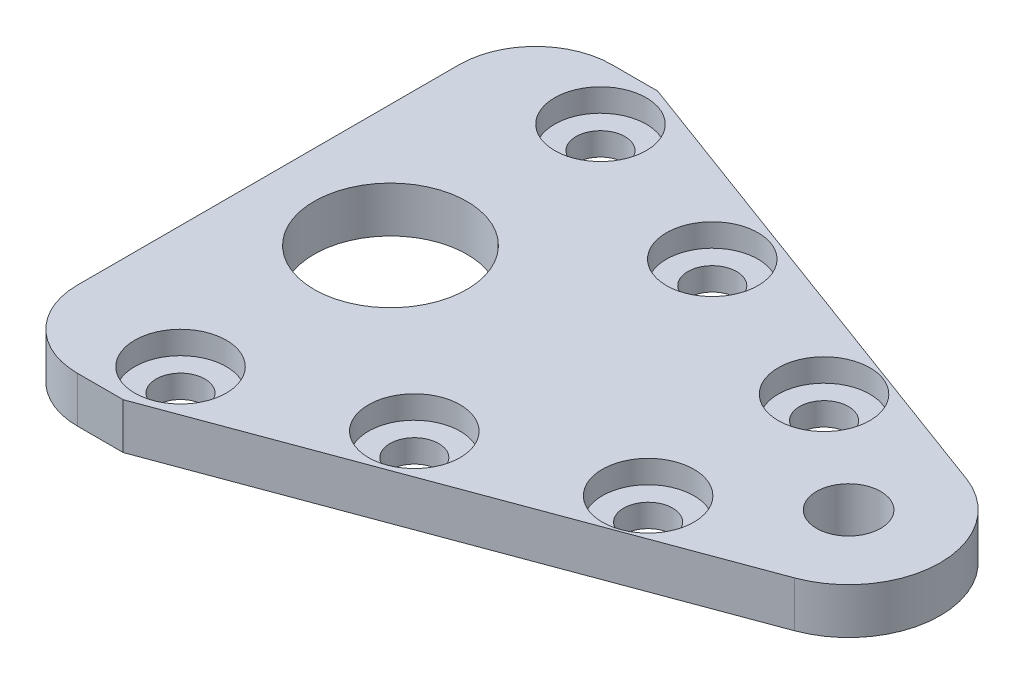
ISO-10303-21;
HEADER;
FILE_DESCRIPTION(('STEP AP214'),'2;1');
FILE_NAME('part.step','',(''),(''),'','','');
FILE_SCHEMA(('AUTOMOTIVE_DESIGN { 1 0 10303 214 1 1 1 1 }'));
ENDSEC;
DATA;
#1=APPLICATION_CONTEXT('core data for automotive mechanical design processes');
#2=APPLICATION_PROTOCOL_DEFINITION('international standard','automotive_design',2000,#1);
#3=PRODUCT_CONTEXT('',#1,'mechanical');
#4=PRODUCT('Part','Part','',(#3));
#5=PRODUCT_RELATED_PRODUCT_CATEGORY('part','',(#4));
#6=PRODUCT_DEFINITION_FORMATION('','',#4);
#7=PRODUCT_DEFINITION_CONTEXT('part definition',#1,'design');
#8=PRODUCT_DEFINITION('design','',#6,#7);
#9=PRODUCT_DEFINITION_SHAPE('','',#8);
#10=(LENGTH_UNIT() NAMED_UNIT(*) SI_UNIT(.MILLI.,.METRE.));
#11=(NAMED_UNIT(*) PLANE_ANGLE_UNIT() SI_UNIT($,.RADIAN.));
#12=(NAMED_UNIT(*) SI_UNIT($,.STERADIAN.) SOLID_ANGLE_UNIT());
#13=UNCERTAINTY_MEASURE_WITH_UNIT(LENGTH_MEASURE(1.E-05),#10,'distance_accuracy_value','');
#14=(GEOMETRIC_REPRESENTATION_CONTEXT(3) GLOBAL_UNCERTAINTY_ASSIGNED_CONTEXT((#13)) GLOBAL_UNIT_ASSIGNED_CONTEXT((#10,
#11,#12)) REPRESENTATION_CONTEXT('',''));
#15=CARTESIAN_POINT('',(0.,0.,0.));
#16=DIRECTION('',(0.,0.,1.));
#17=DIRECTION('',(1.,0.,0.));
#18=AXIS2_PLACEMENT_3D('',#15,#16,#17);
#19=CARTESIAN_POINT('',(0.,-7.,13.75));
#20=DIRECTION('',(0.,1.,0.));
#21=DIRECTION('',(0.,0.,1.));
#22=AXIS2_PLACEMENT_3D('',#19,#20,#21);
#23=CYLINDRICAL_SURFACE('',#22,1.6);
#24=CARTESIAN_POINT('',(0.,0.,13.75));
#25=DIRECTION('',(0.,1.,0.));
#26=DIRECTION('',(0.,0.,1.));
#27=AXIS2_PLACEMENT_3D('',#24,#25,#26);
#28=CIRCLE('',#27,1.6);
#29=CARTESIAN_POINT('',(0.,0.,15.35));
#30=VERTEX_POINT('',#29);
#31=EDGE_CURVE('E172',#30,#30,#28,.T.);
#32=ORIENTED_EDGE('',*,*,#31,.F.);
#33=EDGE_LOOP('',(#32));
#34=FACE_BOUND('',#33,.T.);
#35=CARTESIAN_POINT('',(0.,1.5,13.75));
#36=DIRECTION('',(0.,1.,0.));
#37=DIRECTION('',(0.,0.,1.));
#38=AXIS2_PLACEMENT_3D('',#35,#36,#37);
#39=CIRCLE('',#38,1.6);
#40=CARTESIAN_POINT('',(0.,1.5,15.35));
#41=VERTEX_POINT('',#40);
#42=EDGE_CURVE('E43',#41,#41,#39,.F.);
#43=ORIENTED_EDGE('',*,*,#42,.F.);
#44=EDGE_LOOP('',(#43));
#45=FACE_BOUND('',#44,.T.);
#46=ADVANCED_FACE('F39',(#34,#45),#23,.F.);
#47=CARTESIAN_POINT('',(22.6308770816271,-7.,-5.75979333707286));
#48=DIRECTION('',(0.,1.,0.));
#49=DIRECTION('',(0.,0.,1.));
#50=AXIS2_PLACEMENT_3D('',#47,#48,#49);
#51=CYLINDRICAL_SURFACE('',#50,1.6);
#52=CARTESIAN_POINT('',(22.6308770816271,0.,-5.75979333707286));
#53=DIRECTION('',(0.,1.,0.));
#54=DIRECTION('',(0.,0.,1.));
#55=AXIS2_PLACEMENT_3D('',#52,#53,#54);
#56=CIRCLE('',#55,1.6);
#57=CARTESIAN_POINT('',(22.6308770816271,0.,-4.15979333707286));
#58=VERTEX_POINT('',#57);
#59=EDGE_CURVE('E175',#58,#58,#56,.T.);
#60=ORIENTED_EDGE('',*,*,#59,.F.);
#61=EDGE_LOOP('',(#60));
#62=FACE_BOUND('',#61,.T.);
#63=CARTESIAN_POINT('',(22.6308770816271,1.5,-5.75979333707286));
#64=DIRECTION('',(0.,1.,0.));
#65=DIRECTION('',(0.,0.,1.));
#66=AXIS2_PLACEMENT_3D('',#63,#64,#65);
#67=CIRCLE('',#66,1.6);
#68=CARTESIAN_POINT('',(22.6308770816271,1.5,-4.15979333707286));
#69=VERTEX_POINT('',#68);
#70=EDGE_CURVE('E212',#69,#69,#67,.F.);
#71=ORIENTED_EDGE('',*,*,#70,.F.);
#72=EDGE_LOOP('',(#71));
#73=FACE_BOUND('',#72,.T.);
#74=ADVANCED_FACE('F222',(#62,#73),#51,.F.);
#75=CARTESIAN_POINT('',(11.3154385408135,-7.,-9.75489666853643));
#76=DIRECTION('',(0.,1.,0.));
#77=DIRECTION('',(0.,0.,1.));
#78=AXIS2_PLACEMENT_3D('',#75,#76,#77);
#79=CYLINDRICAL_SURFACE('',#78,1.6);
#80=CARTESIAN_POINT('',(11.3154385408135,0.,-9.75489666853643));
#81=DIRECTION('',(0.,1.,0.));
#82=DIRECTION('',(0.,0.,1.));
#83=AXIS2_PLACEMENT_3D('',#80,#81,#82);
#84=CIRCLE('',#83,1.6);
#85=CARTESIAN_POINT('',(11.3154385408135,0.,-8.15489666853643));
#86=VERTEX_POINT('',#85);
#87=EDGE_CURVE('E178',#86,#86,#84,.T.);
#88=ORIENTED_EDGE('',*,*,#87,.F.);
#89=EDGE_LOOP('',(#88));
#90=FACE_BOUND('',#89,.T.);
#91=CARTESIAN_POINT('',(11.3154385408135,1.5,-9.75489666853643));
#92=DIRECTION('',(0.,1.,0.));
#93=DIRECTION('',(0.,0.,1.));
#94=AXIS2_PLACEMENT_3D('',#91,#92,#93);
#95=CIRCLE('',#94,1.6);
#96=CARTESIAN_POINT('',(11.3154385408135,1.5,-8.15489666853643));
#97=VERTEX_POINT('',#96);
#98=EDGE_CURVE('E210',#97,#97,#95,.F.);
#99=ORIENTED_EDGE('',*,*,#98,.F.);
#100=EDGE_LOOP('',(#99));
#101=FACE_BOUND('',#100,.T.);
#102=ADVANCED_FACE('F228',(#90,#101),#79,.F.);
#103=CARTESIAN_POINT('',(22.6308770816271,-7.,5.75979333707283));
#104=DIRECTION('',(0.,1.,0.));
#105=DIRECTION('',(0.,0.,1.));
#106=AXIS2_PLACEMENT_3D('',#103,#104,#105);
#107=CYLINDRICAL_SURFACE('',#106,1.6);
#108=CARTESIAN_POINT('',(22.6308770816271,0.,5.75979333707283));
#109=DIRECTION('',(0.,1.,0.));
#110=DIRECTION('',(0.,0.,1.));
#111=AXIS2_PLACEMENT_3D('',#108,#109,#110);
#112=CIRCLE('',#111,1.6);
#113=CARTESIAN_POINT('',(22.6308770816271,0.,7.35979333707284));
#114=VERTEX_POINT('',#113);
#115=EDGE_CURVE('E181',#114,#114,#112,.T.);
#116=ORIENTED_EDGE('',*,*,#115,.F.);
#117=EDGE_LOOP('',(#116));
#118=FACE_BOUND('',#117,.T.);
#119=CARTESIAN_POINT('',(22.6308770816271,1.5,5.75979333707283));
#120=DIRECTION('',(0.,1.,0.));
#121=DIRECTION('',(0.,0.,1.));
#122=AXIS2_PLACEMENT_3D('',#119,#120,#121);
#123=CIRCLE('',#122,1.6);
#124=CARTESIAN_POINT('',(22.6308770816271,1.5,7.35979333707284));
#125=VERTEX_POINT('',#124);
#126=EDGE_CURVE('E207',#125,#125,#123,.F.);
#127=ORIENTED_EDGE('',*,*,#126,.F.);
#128=EDGE_LOOP('',(#127));
#129=FACE_BOUND('',#128,.T.);
#130=ADVANCED_FACE('F234',(#118,#129),#107,.F.);
#131=CARTESIAN_POINT('',(11.3154385408135,-7.,9.75489666853641));
#132=DIRECTION('',(0.,1.,0.));
#133=DIRECTION('',(0.,0.,1.));
#134=AXIS2_PLACEMENT_3D('',#131,#132,#133);
#135=CYLINDRICAL_SURFACE('',#134,1.6);
#136=CARTESIAN_POINT('',(11.3154385408135,0.,9.75489666853641));
#137=DIRECTION('',(0.,1.,0.));
#138=DIRECTION('',(0.,0.,1.));
#139=AXIS2_PLACEMENT_3D('',#136,#137,#138);
#140=CIRCLE('',#139,1.6);
#141=CARTESIAN_POINT('',(11.3154385408135,0.,11.3548966685364));
#142=VERTEX_POINT('',#141);
#143=EDGE_CURVE('E184',#142,#142,#140,.T.);
#144=ORIENTED_EDGE('',*,*,#143,.F.);
#145=EDGE_LOOP('',(#144));
#146=FACE_BOUND('',#145,.T.);
#147=CARTESIAN_POINT('',(11.3154385408135,1.5,9.75489666853641));
#148=DIRECTION('',(0.,1.,0.));
#149=DIRECTION('',(0.,0.,1.));
#150=AXIS2_PLACEMENT_3D('',#147,#148,#149);
#151=CIRCLE('',#150,1.6);
#152=CARTESIAN_POINT('',(11.3154385408135,1.5,11.3548966685364));
#153=VERTEX_POINT('',#152);
#154=EDGE_CURVE('E203',#153,#153,#151,.F.);
#155=ORIENTED_EDGE('',*,*,#154,.F.);
#156=EDGE_LOOP('',(#155));
#157=FACE_BOUND('',#156,.T.);
#158=ADVANCED_FACE('F237',(#146,#157),#135,.F.);
#159=CARTESIAN_POINT('',(0.,-7.,-13.75));
#160=DIRECTION('',(0.,1.,0.));
#161=DIRECTION('',(0.,0.,1.));
#162=AXIS2_PLACEMENT_3D('',#159,#160,#161);
#163=CYLINDRICAL_SURFACE('',#162,1.6);
#164=CARTESIAN_POINT('',(0.,0.,-13.75));
#165=DIRECTION('',(0.,1.,0.));
#166=DIRECTION('',(0.,0.,1.));
#167=AXIS2_PLACEMENT_3D('',#164,#165,#166);
#168=CIRCLE('',#167,1.6);
#169=CARTESIAN_POINT('',(0.,0.,-12.15));
#170=VERTEX_POINT('',#169);
#171=EDGE_CURVE('E151',#170,#170,#168,.T.);
#172=ORIENTED_EDGE('',*,*,#171,.F.);
#173=EDGE_LOOP('',(#172));
#174=FACE_BOUND('',#173,.T.);
#175=CARTESIAN_POINT('',(0.,1.5,-13.75));
#176=DIRECTION('',(0.,1.,0.));
#177=DIRECTION('',(0.,0.,1.));
#178=AXIS2_PLACEMENT_3D('',#175,#176,#177);
#179=CIRCLE('',#178,1.6);
#180=CARTESIAN_POINT('',(0.,1.5,-12.15));
#181=VERTEX_POINT('',#180);
#182=EDGE_CURVE('E200',#181,#181,#179,.F.);
#183=ORIENTED_EDGE('',*,*,#182,.F.);
#184=EDGE_LOOP('',(#183));
#185=FACE_BOUND('',#184,.T.);
#186=ADVANCED_FACE('F274',(#174,#185),#163,.F.);
#187=CARTESIAN_POINT('',(30.,3.,0.));
#188=DIRECTION('',(0.,-1.,0.));
#189=DIRECTION('',(0.,0.,-1.));
#190=AXIS2_PLACEMENT_3D('',#187,#188,#189);
#191=CYLINDRICAL_SURFACE('',#190,6.00000000000001);
#192=CARTESIAN_POINT('',(30.,0.,0.));
#193=DIRECTION('',(0.,1.,0.));
#194=DIRECTION('',(0.,0.,1.));
#195=AXIS2_PLACEMENT_3D('',#192,#193,#194);
#196=CIRCLE('',#195,6.00000000000001);
#197=CARTESIAN_POINT('',(32.0824342229641,0.,5.62703009650987));
#198=VERTEX_POINT('',#197);
#199=CARTESIAN_POINT('',(32.0824342229641,0.,-5.62703009650988));
#200=VERTEX_POINT('',#199);
#201=EDGE_CURVE('E124',#198,#200,#196,.T.);
#202=ORIENTED_EDGE('',*,*,#201,.T.);
#203=DIRECTION('',(0.,-1.,0.));
#204=VECTOR('',#203,1.);
#205=CARTESIAN_POINT('',(32.0824342229641,3.,-5.62703009650988));
#206=LINE('',#205,#204);
#207=CARTESIAN_POINT('',(32.0824342229641,3.,-5.62703009650988));
#208=VERTEX_POINT('',#207);
#209=EDGE_CURVE('E121',#208,#200,#206,.T.);
#210=ORIENTED_EDGE('',*,*,#209,.F.);
#211=CARTESIAN_POINT('',(30.,3.,0.));
#212=DIRECTION('',(0.,1.,0.));
#213=DIRECTION('',(0.,0.,1.));
#214=AXIS2_PLACEMENT_3D('',#211,#212,#213);
#215=CIRCLE('',#214,6.00000000000001);
#216=CARTESIAN_POINT('',(32.0824342229641,3.,5.62703009650987));
#217=VERTEX_POINT('',#216);
#218=EDGE_CURVE('E107',#217,#208,#215,.T.);
#219=ORIENTED_EDGE('',*,*,#218,.F.);
#220=DIRECTION('',(0.,-1.,0.));
#221=VECTOR('',#220,1.);
#222=CARTESIAN_POINT('',(32.0824342229641,3.,5.62703009650987));
#223=LINE('',#222,#221);
#224=EDGE_CURVE('E147',#217,#198,#223,.T.);
#225=ORIENTED_EDGE('',*,*,#224,.T.);
#226=EDGE_LOOP('',(#202,#210,#219,#225));
#227=FACE_BOUND('',#226,.T.);
#228=ADVANCED_FACE('F122',(#227),#191,.T.);
#229=CARTESIAN_POINT('',(5.69621113377415,3.,-15.3919634686941));
#230=DIRECTION('',(0.347072370494016,0.,-0.937838349418312));
#231=DIRECTION('',(-0.937838349418313,0.,-0.347072370494016));
#232=AXIS2_PLACEMENT_3D('',#229,#230,#231);
#233=PLANE('',#232);
#234=DIRECTION('',(0.937838349418313,0.,0.347072370494016));
#235=VECTOR('',#234,1.);
#236=CARTESIAN_POINT('',(5.69621113377415,0.,-15.3919634686941));
#237=LINE('',#236,#235);
#238=CARTESIAN_POINT('',(0.,0.,-17.5));
#239=VERTEX_POINT('',#238);
#240=EDGE_CURVE('E153',#239,#200,#237,.T.);
#241=ORIENTED_EDGE('',*,*,#240,.F.);
#242=DIRECTION('',(0.,-1.,0.));
#243=VECTOR('',#242,1.);
#244=CARTESIAN_POINT('',(0.,3.,-17.5));
#245=LINE('',#244,#243);
#246=CARTESIAN_POINT('',(0.,3.,-17.5));
#247=VERTEX_POINT('',#246);
#248=EDGE_CURVE('E129',#247,#239,#245,.T.);
#249=ORIENTED_EDGE('',*,*,#248,.F.);
#250=DIRECTION('',(0.937838349418313,0.,0.347072370494016));
#251=VECTOR('',#250,1.);
#252=CARTESIAN_POINT('',(5.69621113377415,3.,-15.3919634686941));
#253=LINE('',#252,#251);
#254=EDGE_CURVE('E112',#247,#208,#253,.T.);
#255=ORIENTED_EDGE('',*,*,#254,.T.);
#256=ORIENTED_EDGE('',*,*,#209,.T.);
#257=EDGE_LOOP('',(#241,#249,#255,#256));
#258=FACE_BOUND('',#257,.T.);
#259=ADVANCED_FACE('F132',(#258),#233,.T.);
#260=CARTESIAN_POINT('',(0.,3.,-17.5));
#261=DIRECTION('',(0.,0.,-1.));
#262=DIRECTION('',(-1.,0.,0.));
#263=AXIS2_PLACEMENT_3D('',#260,#261,#262);
#264=PLANE('',#263);
#265=DIRECTION('',(1.,0.,0.));
#266=VECTOR('',#265,1.);
#267=CARTESIAN_POINT('',(0.,0.,-17.5));
#268=LINE('',#267,#266);
#269=CARTESIAN_POINT('',(-3.,0.,-17.5));
#270=VERTEX_POINT('',#269);
#271=EDGE_CURVE('E155',#270,#239,#268,.T.);
#272=ORIENTED_EDGE('',*,*,#271,.F.);
#273=DIRECTION('',(0.,-1.,0.));
#274=VECTOR('',#273,1.);
#275=CARTESIAN_POINT('',(-3.,3.,-17.5));
#276=LINE('',#275,#274);
#277=CARTESIAN_POINT('',(-3.,3.,-17.5));
#278=VERTEX_POINT('',#277);
#279=EDGE_CURVE('E64',#270,#278,#276,.F.);
#280=ORIENTED_EDGE('',*,*,#279,.T.);
#281=DIRECTION('',(1.,0.,0.));
#282=VECTOR('',#281,1.);
#283=CARTESIAN_POINT('',(0.,3.,-17.5));
#284=LINE('',#283,#282);
#285=EDGE_CURVE('E134',#278,#247,#284,.T.);
#286=ORIENTED_EDGE('',*,*,#285,.T.);
#287=ORIENTED_EDGE('',*,*,#248,.T.);
#288=EDGE_LOOP('',(#272,#280,#286,#287));
#289=FACE_BOUND('',#288,.T.);
#290=ADVANCED_FACE('F266',(#289),#264,.T.);
#291=CARTESIAN_POINT('',(-8.,3.,0.));
#292=DIRECTION('',(1.,0.,0.));
#293=DIRECTION('',(0.,0.,-1.));
#294=AXIS2_PLACEMENT_3D('',#291,#292,#293);
#295=PLANE('',#294);
#296=DIRECTION('',(0.,0.,1.));
#297=VECTOR('',#296,1.);
#298=CARTESIAN_POINT('',(-8.,3.,0.));
#299=LINE('',#298,#297);
#300=CARTESIAN_POINT('',(-8.,3.,-12.5));
#301=VERTEX_POINT('',#300);
#302=CARTESIAN_POINT('',(-8.,3.,12.5));
#303=VERTEX_POINT('',#302);
#304=EDGE_CURVE('E136',#301,#303,#299,.T.);
#305=ORIENTED_EDGE('',*,*,#304,.F.);
#306=DIRECTION('',(0.,-1.,0.));
#307=VECTOR('',#306,1.);
#308=CARTESIAN_POINT('',(-8.,0.,-12.5));
#309=LINE('',#308,#307);
#310=CARTESIAN_POINT('',(-8.,0.,-12.5));
#311=VERTEX_POINT('',#310);
#312=EDGE_CURVE('E190',#301,#311,#309,.T.);
#313=ORIENTED_EDGE('',*,*,#312,.T.);
#314=DIRECTION('',(0.,0.,1.));
#315=VECTOR('',#314,1.);
#316=CARTESIAN_POINT('',(-8.,0.,0.));
#317=LINE('',#316,#315);
#318=CARTESIAN_POINT('',(-8.,0.,12.5));
#319=VERTEX_POINT('',#318);
#320=EDGE_CURVE('E157',#311,#319,#317,.T.);
#321=ORIENTED_EDGE('',*,*,#320,.T.);
#322=DIRECTION('',(0.,-1.,0.));
#323=VECTOR('',#322,1.);
#324=CARTESIAN_POINT('',(-8.,3.,12.5));
#325=LINE('',#324,#323);
#326=EDGE_CURVE('E128',#319,#303,#325,.F.);
#327=ORIENTED_EDGE('',*,*,#326,.T.);
#328=EDGE_LOOP('',(#305,#313,#321,#327));
#329=FACE_BOUND('',#328,.T.);
#330=ADVANCED_FACE('F262',(#329),#295,.F.);
#331=CARTESIAN_POINT('',(0.,3.,17.5));
#332=DIRECTION('',(0.,0.,-1.));
#333=DIRECTION('',(-1.,0.,0.));
#334=AXIS2_PLACEMENT_3D('',#331,#332,#333);
#335=PLANE('',#334);
#336=DIRECTION('',(1.,0.,0.));
#337=VECTOR('',#336,1.);
#338=CARTESIAN_POINT('',(0.,3.,17.5));
#339=LINE('',#338,#337);
#340=CARTESIAN_POINT('',(-3.,3.,17.5));
#341=VERTEX_POINT('',#340);
#342=CARTESIAN_POINT('',(0.,3.,17.5));
#343=VERTEX_POINT('',#342);
#344=EDGE_CURVE('E141',#341,#343,#339,.T.);
#345=ORIENTED_EDGE('',*,*,#344,.F.);
#346=DIRECTION('',(0.,-1.,0.));
#347=VECTOR('',#346,1.);
#348=CARTESIAN_POINT('',(-3.,3.,17.5));
#349=LINE('',#348,#347);
#350=CARTESIAN_POINT('',(-3.,0.,17.5));
#351=VERTEX_POINT('',#350);
#352=EDGE_CURVE('E11',#341,#351,#349,.T.);
#353=ORIENTED_EDGE('',*,*,#352,.T.);
#354=DIRECTION('',(1.,0.,0.));
#355=VECTOR('',#354,1.);
#356=CARTESIAN_POINT('',(0.,0.,17.5));
#357=LINE('',#356,#355);
#358=CARTESIAN_POINT('',(0.,0.,17.5));
#359=VERTEX_POINT('',#358);
#360=EDGE_CURVE('E160',#351,#359,#357,.T.);
#361=ORIENTED_EDGE('',*,*,#360,.T.);
#362=DIRECTION('',(0.,-1.,0.));
#363=VECTOR('',#362,1.);
#364=CARTESIAN_POINT('',(0.,3.,17.5));
#365=LINE('',#364,#363);
#366=EDGE_CURVE('E168',#343,#359,#365,.T.);
#367=ORIENTED_EDGE('',*,*,#366,.F.);
#368=EDGE_LOOP('',(#345,#353,#361,#367));
#369=FACE_BOUND('',#368,.T.);
#370=ADVANCED_FACE('F258',(#369),#335,.F.);
#371=CARTESIAN_POINT('',(5.69621113377415,3.,15.3919634686941));
#372=DIRECTION('',(-0.347072370494016,0.,-0.937838349418312));
#373=DIRECTION('',(-0.937838349418313,0.,0.347072370494016));
#374=AXIS2_PLACEMENT_3D('',#371,#372,#373);
#375=PLANE('',#374);
#376=DIRECTION('',(0.937838349418313,0.,-0.347072370494016));
#377=VECTOR('',#376,1.);
#378=CARTESIAN_POINT('',(5.69621113377415,0.,15.3919634686941));
#379=LINE('',#378,#377);
#380=EDGE_CURVE('E162',#359,#198,#379,.T.);
#381=ORIENTED_EDGE('',*,*,#380,.T.);
#382=ORIENTED_EDGE('',*,*,#224,.F.);
#383=DIRECTION('',(0.937838349418313,0.,-0.347072370494016));
#384=VECTOR('',#383,1.);
#385=CARTESIAN_POINT('',(5.69621113377415,3.,15.3919634686941));
#386=LINE('',#385,#384);
#387=EDGE_CURVE('E114',#343,#217,#386,.T.);
#388=ORIENTED_EDGE('',*,*,#387,.F.);
#389=ORIENTED_EDGE('',*,*,#366,.T.);
#390=EDGE_LOOP('',(#381,#382,#388,#389));
#391=FACE_BOUND('',#390,.T.);
#392=ADVANCED_FACE('F255',(#391),#375,.F.);
#393=CARTESIAN_POINT('',(30.,3.,0.));
#394=DIRECTION('',(0.,-1.,0.));
#395=DIRECTION('',(0.,0.,-1.));
#396=AXIS2_PLACEMENT_3D('',#393,#394,#395);
#397=CYLINDRICAL_SURFACE('',#396,2.09999999999999);
#398=CARTESIAN_POINT('',(30.,3.,0.));
#399=DIRECTION('',(0.,1.,0.));
#400=DIRECTION('',(0.,0.,1.));
#401=AXIS2_PLACEMENT_3D('',#398,#399,#400);
#402=CIRCLE('',#401,2.09999999999999);
#403=CARTESIAN_POINT('',(30.,3.,2.09999999999999));
#404=VERTEX_POINT('',#403);
#405=EDGE_CURVE('E118',#404,#404,#402,.T.);
#406=ORIENTED_EDGE('',*,*,#405,.T.);
#407=EDGE_LOOP('',(#406));
#408=FACE_BOUND('',#407,.T.);
#409=CARTESIAN_POINT('',(30.,0.,0.));
#410=DIRECTION('',(0.,1.,0.));
#411=DIRECTION('',(0.,0.,1.));
#412=AXIS2_PLACEMENT_3D('',#409,#410,#411);
#413=CIRCLE('',#412,2.09999999999999);
#414=CARTESIAN_POINT('',(30.,0.,2.09999999999999));
#415=VERTEX_POINT('',#414);
#416=EDGE_CURVE('E148',#415,#415,#413,.T.);
#417=ORIENTED_EDGE('',*,*,#416,.F.);
#418=EDGE_LOOP('',(#417));
#419=FACE_BOUND('',#418,.T.);
#420=ADVANCED_FACE('F253',(#408,#419),#397,.F.);
#421=CARTESIAN_POINT('',(0.,3.,0.));
#422=DIRECTION('',(0.,-1.,0.));
#423=DIRECTION('',(0.,0.,-1.));
#424=AXIS2_PLACEMENT_3D('',#421,#422,#423);
#425=CYLINDRICAL_SURFACE('',#424,5.);
#426=CARTESIAN_POINT('',(0.,3.,0.));
#427=DIRECTION('',(0.,1.,0.));
#428=DIRECTION('',(0.,0.,1.));
#429=AXIS2_PLACEMENT_3D('',#426,#427,#428);
#430=CIRCLE('',#429,5.);
#431=CARTESIAN_POINT('',(0.,3.,5.));
#432=VERTEX_POINT('',#431);
#433=EDGE_CURVE('E144',#432,#432,#430,.T.);
#434=ORIENTED_EDGE('',*,*,#433,.T.);
#435=EDGE_LOOP('',(#434));
#436=FACE_BOUND('',#435,.T.);
#437=CARTESIAN_POINT('',(0.,0.,0.));
#438=DIRECTION('',(0.,1.,0.));
#439=DIRECTION('',(0.,0.,1.));
#440=AXIS2_PLACEMENT_3D('',#437,#438,#439);
#441=CIRCLE('',#440,5.);
#442=CARTESIAN_POINT('',(0.,0.,5.));
#443=VERTEX_POINT('',#442);
#444=EDGE_CURVE('E164',#443,#443,#441,.T.);
#445=ORIENTED_EDGE('',*,*,#444,.F.);
#446=EDGE_LOOP('',(#445));
#447=FACE_BOUND('',#446,.T.);
#448=ADVANCED_FACE('F245',(#436,#447),#425,.F.);
#449=CARTESIAN_POINT('',(0.,3.,0.));
#450=DIRECTION('',(0.,1.,0.));
#451=DIRECTION('',(0.,0.,1.));
#452=AXIS2_PLACEMENT_3D('',#449,#450,#451);
#453=PLANE('',#452);
#454=CARTESIAN_POINT('',(0.,3.,13.75));
#455=DIRECTION('',(0.,1.,0.));
#456=DIRECTION('',(0.,0.,1.));
#457=AXIS2_PLACEMENT_3D('',#454,#455,#456);
#458=CIRCLE('',#457,3.);
#459=CARTESIAN_POINT('',(0.,3.,16.75));
#460=VERTEX_POINT('',#459);
#461=EDGE_CURVE('E354',#460,#460,#458,.T.);
#462=ORIENTED_EDGE('',*,*,#461,.F.);
#463=EDGE_LOOP('',(#462));
#464=FACE_BOUND('',#463,.T.);
#465=CARTESIAN_POINT('',(11.3154385408135,3.,9.75489666853641));
#466=DIRECTION('',(0.,1.,0.));
#467=DIRECTION('',(0.,0.,1.));
#468=AXIS2_PLACEMENT_3D('',#465,#466,#467);
#469=CIRCLE('',#468,3.);
#470=CARTESIAN_POINT('',(11.3154385408135,3.,12.7548966685364));
#471=VERTEX_POINT('',#470);
#472=EDGE_CURVE('E353',#471,#471,#469,.T.);
#473=ORIENTED_EDGE('',*,*,#472,.F.);
#474=EDGE_LOOP('',(#473));
#475=FACE_BOUND('',#474,.T.);
#476=CARTESIAN_POINT('',(22.6308770816271,3.,5.75979333707283));
#477=DIRECTION('',(0.,1.,0.));
#478=DIRECTION('',(0.,0.,1.));
#479=AXIS2_PLACEMENT_3D('',#476,#477,#478);
#480=CIRCLE('',#479,3.);
#481=CARTESIAN_POINT('',(22.6308770816271,3.,8.75979333707284));
#482=VERTEX_POINT('',#481);
#483=EDGE_CURVE('E392',#482,#482,#480,.T.);
#484=ORIENTED_EDGE('',*,*,#483,.F.);
#485=EDGE_LOOP('',(#484));
#486=FACE_BOUND('',#485,.T.);
#487=CARTESIAN_POINT('',(22.6308770816271,3.,-5.75979333707286));
#488=DIRECTION('',(0.,1.,0.));
#489=DIRECTION('',(0.,0.,1.));
#490=AXIS2_PLACEMENT_3D('',#487,#488,#489);
#491=CIRCLE('',#490,3.);
#492=CARTESIAN_POINT('',(22.6308770816271,3.,-2.75979333707286));
#493=VERTEX_POINT('',#492);
#494=EDGE_CURVE('E386',#493,#493,#491,.T.);
#495=ORIENTED_EDGE('',*,*,#494,.F.);
#496=EDGE_LOOP('',(#495));
#497=FACE_BOUND('',#496,.T.);
#498=CARTESIAN_POINT('',(11.3154385408135,3.,-9.75489666853643));
#499=DIRECTION('',(0.,1.,0.));
#500=DIRECTION('',(0.,0.,1.));
#501=AXIS2_PLACEMENT_3D('',#498,#499,#500);
#502=CIRCLE('',#501,3.);
#503=CARTESIAN_POINT('',(11.3154385408135,3.,-6.75489666853643));
#504=VERTEX_POINT('',#503);
#505=EDGE_CURVE('E376',#504,#504,#502,.T.);
#506=ORIENTED_EDGE('',*,*,#505,.F.);
#507=EDGE_LOOP('',(#506));
#508=FACE_BOUND('',#507,.T.);
#509=CARTESIAN_POINT('',(0.,3.,-13.75));
#510=DIRECTION('',(0.,1.,0.));
#511=DIRECTION('',(0.,0.,1.));
#512=AXIS2_PLACEMENT_3D('',#509,#510,#511);
#513=CIRCLE('',#512,3.);
#514=CARTESIAN_POINT('',(0.,3.,-10.75));
#515=VERTEX_POINT('',#514);
#516=EDGE_CURVE('E364',#515,#515,#513,.T.);
#517=ORIENTED_EDGE('',*,*,#516,.F.);
#518=EDGE_LOOP('',(#517));
#519=FACE_BOUND('',#518,.T.);
#520=ORIENTED_EDGE('',*,*,#405,.F.);
#521=EDGE_LOOP('',(#520));
#522=FACE_BOUND('',#521,.T.);
#523=ORIENTED_EDGE('',*,*,#285,.F.);
#524=CARTESIAN_POINT('',(-3.,3.,-12.5));
#525=DIRECTION('',(0.,1.,0.));
#526=DIRECTION('',(0.,0.,1.));
#527=AXIS2_PLACEMENT_3D('',#524,#525,#526);
#528=CIRCLE('',#527,5.);
#529=EDGE_CURVE('E48',#278,#301,#528,.T.);
#530=ORIENTED_EDGE('',*,*,#529,.T.);
#531=ORIENTED_EDGE('',*,*,#304,.T.);
#532=CARTESIAN_POINT('',(-3.,3.,12.5));
#533=DIRECTION('',(0.,1.,0.));
#534=DIRECTION('',(0.,0.,1.));
#535=AXIS2_PLACEMENT_3D('',#532,#533,#534);
#536=CIRCLE('',#535,5.);
#537=EDGE_CURVE('E56',#303,#341,#536,.T.);
#538=ORIENTED_EDGE('',*,*,#537,.T.);
#539=ORIENTED_EDGE('',*,*,#344,.T.);
#540=ORIENTED_EDGE('',*,*,#387,.T.);
#541=ORIENTED_EDGE('',*,*,#218,.T.);
#542=ORIENTED_EDGE('',*,*,#254,.F.);
#543=EDGE_LOOP('',(#523,#530,#531,#538,#539,#540,#541,#542));
#544=FACE_BOUND('',#543,.T.);
#545=ORIENTED_EDGE('',*,*,#433,.F.);
#546=EDGE_LOOP('',(#545));
#547=FACE_BOUND('',#546,.T.);
#548=ADVANCED_FACE('F109',(#464,#475,#486,#497,#508,#519,#522,#544,#547),#453,.T.);
#549=CARTESIAN_POINT('',(0.,0.,0.));
#550=DIRECTION('',(0.,1.,0.));
#551=DIRECTION('',(0.,0.,1.));
#552=AXIS2_PLACEMENT_3D('',#549,#550,#551);
#553=PLANE('',#552);
#554=ORIENTED_EDGE('',*,*,#171,.T.);
#555=EDGE_LOOP('',(#554));
#556=FACE_BOUND('',#555,.T.);
#557=ORIENTED_EDGE('',*,*,#143,.T.);
#558=EDGE_LOOP('',(#557));
#559=FACE_BOUND('',#558,.T.);
#560=ORIENTED_EDGE('',*,*,#115,.T.);
#561=EDGE_LOOP('',(#560));
#562=FACE_BOUND('',#561,.T.);
#563=ORIENTED_EDGE('',*,*,#87,.T.);
#564=EDGE_LOOP('',(#563));
#565=FACE_BOUND('',#564,.T.);
#566=ORIENTED_EDGE('',*,*,#59,.T.);
#567=EDGE_LOOP('',(#566));
#568=FACE_BOUND('',#567,.T.);
#569=ORIENTED_EDGE('',*,*,#31,.T.);
#570=EDGE_LOOP('',(#569));
#571=FACE_BOUND('',#570,.T.);
#572=ORIENTED_EDGE('',*,*,#416,.T.);
#573=EDGE_LOOP('',(#572));
#574=FACE_BOUND('',#573,.T.);
#575=ORIENTED_EDGE('',*,*,#320,.F.);
#576=CARTESIAN_POINT('',(-3.,0.,-12.5));
#577=DIRECTION('',(0.,1.,0.));
#578=DIRECTION('',(0.,0.,1.));
#579=AXIS2_PLACEMENT_3D('',#576,#577,#578);
#580=CIRCLE('',#579,5.);
#581=EDGE_CURVE('E195',#311,#270,#580,.F.);
#582=ORIENTED_EDGE('',*,*,#581,.T.);
#583=ORIENTED_EDGE('',*,*,#271,.T.);
#584=ORIENTED_EDGE('',*,*,#240,.T.);
#585=ORIENTED_EDGE('',*,*,#201,.F.);
#586=ORIENTED_EDGE('',*,*,#380,.F.);
#587=ORIENTED_EDGE('',*,*,#360,.F.);
#588=CARTESIAN_POINT('',(-3.,0.,12.5));
#589=DIRECTION('',(0.,1.,0.));
#590=DIRECTION('',(0.,0.,1.));
#591=AXIS2_PLACEMENT_3D('',#588,#589,#590);
#592=CIRCLE('',#591,5.);
#593=EDGE_CURVE('E193',#351,#319,#592,.F.);
#594=ORIENTED_EDGE('',*,*,#593,.T.);
#595=EDGE_LOOP('',(#575,#582,#583,#584,#585,#586,#587,#594));
#596=FACE_BOUND('',#595,.T.);
#597=ORIENTED_EDGE('',*,*,#444,.T.);
#598=EDGE_LOOP('',(#597));
#599=FACE_BOUND('',#598,.T.);
#600=ADVANCED_FACE('F244',(#556,#559,#562,#565,#568,#571,#574,#596,#599),#553,.F.);
#601=CARTESIAN_POINT('',(-3.,3.,-12.5));
#602=DIRECTION('',(0.,1.,0.));
#603=DIRECTION('',(0.,0.,1.));
#604=AXIS2_PLACEMENT_3D('',#601,#602,#603);
#605=CYLINDRICAL_SURFACE('',#604,5.);
#606=ORIENTED_EDGE('',*,*,#529,.F.);
#607=ORIENTED_EDGE('',*,*,#279,.F.);
#608=ORIENTED_EDGE('',*,*,#581,.F.);
#609=ORIENTED_EDGE('',*,*,#312,.F.);
#610=EDGE_LOOP('',(#606,#607,#608,#609));
#611=FACE_BOUND('',#610,.T.);
#612=ADVANCED_FACE('F249',(#611),#605,.T.);
#613=CARTESIAN_POINT('',(-3.,3.,12.5));
#614=DIRECTION('',(0.,-1.,0.));
#615=DIRECTION('',(0.,0.,-1.));
#616=AXIS2_PLACEMENT_3D('',#613,#614,#615);
#617=CYLINDRICAL_SURFACE('',#616,5.);
#618=ORIENTED_EDGE('',*,*,#537,.F.);
#619=ORIENTED_EDGE('',*,*,#326,.F.);
#620=ORIENTED_EDGE('',*,*,#593,.F.);
#621=ORIENTED_EDGE('',*,*,#352,.F.);
#622=EDGE_LOOP('',(#618,#619,#620,#621));
#623=FACE_BOUND('',#622,.T.);
#624=ADVANCED_FACE('F41',(#623),#617,.T.);
#625=CARTESIAN_POINT('',(0.,1.5,-13.75));
#626=DIRECTION('',(0.,1.,0.));
#627=DIRECTION('',(0.,0.,1.));
#628=AXIS2_PLACEMENT_3D('',#625,#626,#627);
#629=PLANE('',#628);
#630=CARTESIAN_POINT('',(0.,1.5,-13.75));
#631=DIRECTION('',(0.,1.,0.));
#632=DIRECTION('',(0.,0.,1.));
#633=AXIS2_PLACEMENT_3D('',#630,#631,#632);
#634=CIRCLE('',#633,3.);
#635=CARTESIAN_POINT('',(0.,1.5,-10.75));
#636=VERTEX_POINT('',#635);
#637=EDGE_CURVE('E204',#636,#636,#634,.T.);
#638=ORIENTED_EDGE('',*,*,#637,.T.);
#639=EDGE_LOOP('',(#638));
#640=FACE_BOUND('',#639,.T.);
#641=ORIENTED_EDGE('',*,*,#182,.T.);
#642=EDGE_LOOP('',(#641));
#643=FACE_BOUND('',#642,.T.);
#644=ADVANCED_FACE('F282',(#640,#643),#629,.T.);
#645=CARTESIAN_POINT('',(0.,1.5,-13.75));
#646=DIRECTION('',(0.,1.,0.));
#647=DIRECTION('',(0.,0.,1.));
#648=AXIS2_PLACEMENT_3D('',#645,#646,#647);
#649=CYLINDRICAL_SURFACE('',#648,3.);
#650=ORIENTED_EDGE('',*,*,#637,.F.);
#651=EDGE_LOOP('',(#650));
#652=FACE_BOUND('',#651,.T.);
#653=ORIENTED_EDGE('',*,*,#516,.T.);
#654=EDGE_LOOP('',(#653));
#655=FACE_BOUND('',#654,.T.);
#656=ADVANCED_FACE('F300',(#652,#655),#649,.F.);
#657=CARTESIAN_POINT('',(11.3154385408135,1.5,9.75489666853641));
#658=DIRECTION('',(0.,1.,0.));
#659=DIRECTION('',(0.,0.,1.));
#660=AXIS2_PLACEMENT_3D('',#657,#658,#659);
#661=PLANE('',#660);
#662=CARTESIAN_POINT('',(11.3154385408135,1.5,9.75489666853641));
#663=DIRECTION('',(0.,1.,0.));
#664=DIRECTION('',(0.,0.,1.));
#665=AXIS2_PLACEMENT_3D('',#662,#663,#664);
#666=CIRCLE('',#665,3.);
#667=CARTESIAN_POINT('',(11.3154385408135,1.5,12.7548966685364));
#668=VERTEX_POINT('',#667);
#669=EDGE_CURVE('E357',#668,#668,#666,.T.);
#670=ORIENTED_EDGE('',*,*,#669,.T.);
#671=EDGE_LOOP('',(#670));
#672=FACE_BOUND('',#671,.T.);
#673=ORIENTED_EDGE('',*,*,#154,.T.);
#674=EDGE_LOOP('',(#673));
#675=FACE_BOUND('',#674,.T.);
#676=ADVANCED_FACE('F306',(#672,#675),#661,.T.);
#677=CARTESIAN_POINT('',(11.3154385408135,1.5,9.75489666853641));
#678=DIRECTION('',(0.,1.,0.));
#679=DIRECTION('',(0.,0.,1.));
#680=AXIS2_PLACEMENT_3D('',#677,#678,#679);
#681=CYLINDRICAL_SURFACE('',#680,3.);
#682=ORIENTED_EDGE('',*,*,#669,.F.);
#683=EDGE_LOOP('',(#682));
#684=FACE_BOUND('',#683,.T.);
#685=ORIENTED_EDGE('',*,*,#472,.T.);
#686=EDGE_LOOP('',(#685));
#687=FACE_BOUND('',#686,.T.);
#688=ADVANCED_FACE('F326',(#684,#687),#681,.F.);
#689=CARTESIAN_POINT('',(22.6308770816271,1.5,5.75979333707283));
#690=DIRECTION('',(0.,1.,0.));
#691=DIRECTION('',(0.,0.,1.));
#692=AXIS2_PLACEMENT_3D('',#689,#690,#691);
#693=PLANE('',#692);
#694=CARTESIAN_POINT('',(22.6308770816271,1.5,5.75979333707283));
#695=DIRECTION('',(0.,1.,0.));
#696=DIRECTION('',(0.,0.,1.));
#697=AXIS2_PLACEMENT_3D('',#694,#695,#696);
#698=CIRCLE('',#697,3.);
#699=CARTESIAN_POINT('',(22.6308770816271,1.5,8.75979333707284));
#700=VERTEX_POINT('',#699);
#701=EDGE_CURVE('E389',#700,#700,#698,.T.);
#702=ORIENTED_EDGE('',*,*,#701,.T.);
#703=EDGE_LOOP('',(#702));
#704=FACE_BOUND('',#703,.T.);
#705=ORIENTED_EDGE('',*,*,#126,.T.);
#706=EDGE_LOOP('',(#705));
#707=FACE_BOUND('',#706,.T.);
#708=ADVANCED_FACE('F332',(#704,#707),#693,.T.);
#709=CARTESIAN_POINT('',(22.6308770816271,1.5,5.75979333707283));
#710=DIRECTION('',(0.,1.,0.));
#711=DIRECTION('',(0.,0.,1.));
#712=AXIS2_PLACEMENT_3D('',#709,#710,#711);
#713=CYLINDRICAL_SURFACE('',#712,3.);
#714=ORIENTED_EDGE('',*,*,#701,.F.);
#715=EDGE_LOOP('',(#714));
#716=FACE_BOUND('',#715,.T.);
#717=ORIENTED_EDGE('',*,*,#483,.T.);
#718=EDGE_LOOP('',(#717));
#719=FACE_BOUND('',#718,.T.);
#720=ADVANCED_FACE('F337',(#716,#719),#713,.F.);
#721=CARTESIAN_POINT('',(11.3154385408135,1.5,-9.75489666853643));
#722=DIRECTION('',(0.,1.,0.));
#723=DIRECTION('',(0.,0.,1.));
#724=AXIS2_PLACEMENT_3D('',#721,#722,#723);
#725=PLANE('',#724);
#726=CARTESIAN_POINT('',(11.3154385408135,1.5,-9.75489666853643));
#727=DIRECTION('',(0.,1.,0.));
#728=DIRECTION('',(0.,0.,1.));
#729=AXIS2_PLACEMENT_3D('',#726,#727,#728);
#730=CIRCLE('',#729,3.);
#731=CARTESIAN_POINT('',(11.3154385408135,1.5,-6.75489666853643));
#732=VERTEX_POINT('',#731);
#733=EDGE_CURVE('E366',#732,#732,#730,.T.);
#734=ORIENTED_EDGE('',*,*,#733,.T.);
#735=EDGE_LOOP('',(#734));
#736=FACE_BOUND('',#735,.T.);
#737=ORIENTED_EDGE('',*,*,#98,.T.);
#738=EDGE_LOOP('',(#737));
#739=FACE_BOUND('',#738,.T.);
#740=ADVANCED_FACE('F408',(#736,#739),#725,.T.);
#741=CARTESIAN_POINT('',(11.3154385408135,1.5,-9.75489666853643));
#742=DIRECTION('',(0.,1.,0.));
#743=DIRECTION('',(0.,0.,1.));
#744=AXIS2_PLACEMENT_3D('',#741,#742,#743);
#745=CYLINDRICAL_SURFACE('',#744,3.);
#746=ORIENTED_EDGE('',*,*,#733,.F.);
#747=EDGE_LOOP('',(#746));
#748=FACE_BOUND('',#747,.T.);
#749=ORIENTED_EDGE('',*,*,#505,.T.);
#750=EDGE_LOOP('',(#749));
#751=FACE_BOUND('',#750,.T.);
#752=ADVANCED_FACE('F406',(#748,#751),#745,.F.);
#753=CARTESIAN_POINT('',(22.6308770816271,1.5,-5.75979333707286));
#754=DIRECTION('',(0.,1.,0.));
#755=DIRECTION('',(0.,0.,1.));
#756=AXIS2_PLACEMENT_3D('',#753,#754,#755);
#757=PLANE('',#756);
#758=CARTESIAN_POINT('',(22.6308770816271,1.5,-5.75979333707286));
#759=DIRECTION('',(0.,1.,0.));
#760=DIRECTION('',(0.,0.,1.));
#761=AXIS2_PLACEMENT_3D('',#758,#759,#760);
#762=CIRCLE('',#761,3.);
#763=CARTESIAN_POINT('',(22.6308770816271,1.5,-2.75979333707286));
#764=VERTEX_POINT('',#763);
#765=EDGE_CURVE('E381',#764,#764,#762,.T.);
#766=ORIENTED_EDGE('',*,*,#765,.T.);
#767=EDGE_LOOP('',(#766));
#768=FACE_BOUND('',#767,.T.);
#769=ORIENTED_EDGE('',*,*,#70,.T.);
#770=EDGE_LOOP('',(#769));
#771=FACE_BOUND('',#770,.T.);
#772=ADVANCED_FACE('F347',(#768,#771),#757,.T.);
#773=CARTESIAN_POINT('',(22.6308770816271,1.5,-5.75979333707286));
#774=DIRECTION('',(0.,1.,0.));
#775=DIRECTION('',(0.,0.,1.));
#776=AXIS2_PLACEMENT_3D('',#773,#774,#775);
#777=CYLINDRICAL_SURFACE('',#776,3.);
#778=ORIENTED_EDGE('',*,*,#765,.F.);
#779=EDGE_LOOP('',(#778));
#780=FACE_BOUND('',#779,.T.);
#781=ORIENTED_EDGE('',*,*,#494,.T.);
#782=EDGE_LOOP('',(#781));
#783=FACE_BOUND('',#782,.T.);
#784=ADVANCED_FACE('F340',(#780,#783),#777,.F.);
#785=CARTESIAN_POINT('',(0.,1.5,13.75));
#786=DIRECTION('',(0.,1.,0.));
#787=DIRECTION('',(0.,0.,1.));
#788=AXIS2_PLACEMENT_3D('',#785,#786,#787);
#789=PLANE('',#788);
#790=CARTESIAN_POINT('',(0.,1.5,13.75));
#791=DIRECTION('',(0.,1.,0.));
#792=DIRECTION('',(0.,0.,1.));
#793=AXIS2_PLACEMENT_3D('',#790,#791,#792);
#794=CIRCLE('',#793,3.);
#795=CARTESIAN_POINT('',(0.,1.5,16.75));
#796=VERTEX_POINT('',#795);
#797=EDGE_CURVE('E352',#796,#796,#794,.T.);
#798=ORIENTED_EDGE('',*,*,#797,.T.);
#799=EDGE_LOOP('',(#798));
#800=FACE_BOUND('',#799,.T.);
#801=ORIENTED_EDGE('',*,*,#42,.T.);
#802=EDGE_LOOP('',(#801));
#803=FACE_BOUND('',#802,.T.);
#804=ADVANCED_FACE('F219',(#800,#803),#789,.T.);
#805=CARTESIAN_POINT('',(0.,1.5,13.75));
#806=DIRECTION('',(0.,1.,0.));
#807=DIRECTION('',(0.,0.,1.));
#808=AXIS2_PLACEMENT_3D('',#805,#806,#807);
#809=CYLINDRICAL_SURFACE('',#808,3.);
#810=ORIENTED_EDGE('',*,*,#797,.F.);
#811=EDGE_LOOP('',(#810));
#812=FACE_BOUND('',#811,.T.);
#813=ORIENTED_EDGE('',*,*,#461,.T.);
#814=EDGE_LOOP('',(#813));
#815=FACE_BOUND('',#814,.T.);
#816=ADVANCED_FACE('F312',(#812,#815),#809,.F.);
#817=CLOSED_SHELL('',(#46,#74,#102,#130,#158,#186,#228,#259,#290,#330,#370,#392,#420,#448,#548,
#600,#612,#624,#644,#656,#676,#688,#708,#720,#740,#752,#772,#784,#804,#816));
#818=MANIFOLD_SOLID_BREP('B2',#817);
#819=ADVANCED_BREP_SHAPE_REPRESENTATION('',(#18,#818),#14);
#820=SHAPE_DEFINITION_REPRESENTATION(#9,#819);
ENDSEC;
END-ISO-10303-21;
